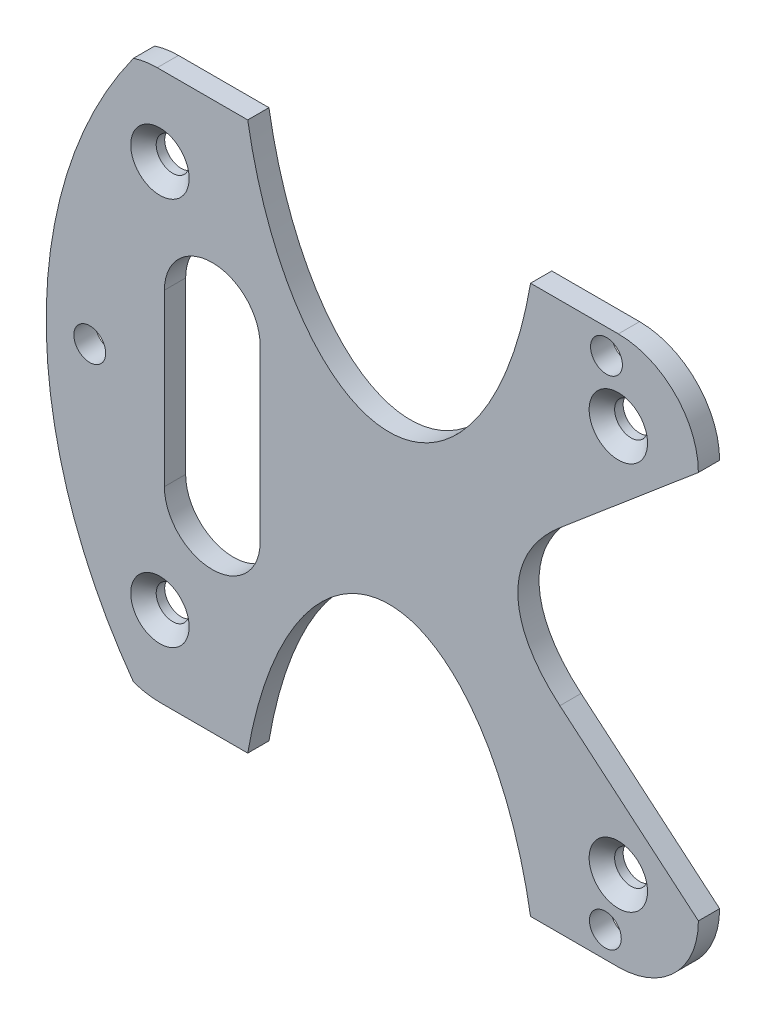
ISO-10303-21;
HEADER;
FILE_DESCRIPTION(('STEP AP214'),'2;1');
FILE_NAME('part.step','',(''),(''),'','','');
FILE_SCHEMA(('AUTOMOTIVE_DESIGN { 1 0 10303 214 1 1 1 1 }'));
ENDSEC;
DATA;
#1=APPLICATION_CONTEXT('core data for automotive mechanical design processes');
#2=APPLICATION_PROTOCOL_DEFINITION('international standard','automotive_design',2000,#1);
#3=PRODUCT_CONTEXT('',#1,'mechanical');
#4=PRODUCT('Part','Part','',(#3));
#5=PRODUCT_RELATED_PRODUCT_CATEGORY('part','',(#4));
#6=PRODUCT_DEFINITION_FORMATION('','',#4);
#7=PRODUCT_DEFINITION_CONTEXT('part definition',#1,'design');
#8=PRODUCT_DEFINITION('design','',#6,#7);
#9=PRODUCT_DEFINITION_SHAPE('','',#8);
#10=(LENGTH_UNIT() NAMED_UNIT(*) SI_UNIT(.MILLI.,.METRE.));
#11=(NAMED_UNIT(*) PLANE_ANGLE_UNIT() SI_UNIT($,.RADIAN.));
#12=(NAMED_UNIT(*) SI_UNIT($,.STERADIAN.) SOLID_ANGLE_UNIT());
#13=UNCERTAINTY_MEASURE_WITH_UNIT(LENGTH_MEASURE(1.E-05),#10,'distance_accuracy_value','');
#14=(GEOMETRIC_REPRESENTATION_CONTEXT(3) GLOBAL_UNCERTAINTY_ASSIGNED_CONTEXT((#13)) GLOBAL_UNIT_ASSIGNED_CONTEXT((#10,
#11,#12)) REPRESENTATION_CONTEXT('',''));
#15=CARTESIAN_POINT('',(0.,0.,0.));
#16=DIRECTION('',(0.,0.,1.));
#17=DIRECTION('',(1.,0.,0.));
#18=AXIS2_PLACEMENT_3D('',#15,#16,#17);
#19=CARTESIAN_POINT('',(0.,-5.,2.));
#20=DIRECTION('',(0.,1.,0.));
#21=DIRECTION('',(-1.,0.,0.));
#22=AXIS2_PLACEMENT_3D('',#19,#20,#21);
#23=PLANE('',#22);
#24=DIRECTION('',(1.,0.,0.));
#25=VECTOR('',#24,1.);
#26=CARTESIAN_POINT('',(0.,-5.,2.));
#27=LINE('',#26,#25);
#28=CARTESIAN_POINT('',(-10.8103320712815,-5.00000000000013,2.));
#29=VERTEX_POINT('',#28);
#30=CARTESIAN_POINT('',(-2.54,-5.,2.));
#31=VERTEX_POINT('',#30);
#32=EDGE_CURVE('E405',#29,#31,#27,.T.);
#33=ORIENTED_EDGE('',*,*,#32,.F.);
#34=DIRECTION('',(0.,0.,-1.));
#35=VECTOR('',#34,1.);
#36=CARTESIAN_POINT('',(-10.8103320712815,-5.00000000000013,2.));
#37=LINE('',#36,#35);
#38=CARTESIAN_POINT('',(-10.8103320712815,-5.00000000000013,0.));
#39=VERTEX_POINT('',#38);
#40=EDGE_CURVE('E284',#29,#39,#37,.T.);
#41=ORIENTED_EDGE('',*,*,#40,.T.);
#42=DIRECTION('',(1.,0.,0.));
#43=VECTOR('',#42,1.);
#44=CARTESIAN_POINT('',(0.,-5.,0.));
#45=LINE('',#44,#43);
#46=CARTESIAN_POINT('',(-2.54,-5.,0.));
#47=VERTEX_POINT('',#46);
#48=EDGE_CURVE('E400',#39,#47,#45,.T.);
#49=ORIENTED_EDGE('',*,*,#48,.T.);
#50=DIRECTION('',(0.,0.,-1.));
#51=VECTOR('',#50,1.);
#52=CARTESIAN_POINT('',(-2.54,-5.,2.));
#53=LINE('',#52,#51);
#54=EDGE_CURVE('E123',#31,#47,#53,.T.);
#55=ORIENTED_EDGE('',*,*,#54,.F.);
#56=EDGE_LOOP('',(#33,#41,#49,#55));
#57=FACE_BOUND('',#56,.T.);
#58=ADVANCED_FACE('F115',(#57),#23,.F.);
#59=CARTESIAN_POINT('',(0.,46.656,2.));
#60=DIRECTION('',(0.,-1.,0.));
#61=DIRECTION('',(0.,0.,-1.));
#62=AXIS2_PLACEMENT_3D('',#59,#60,#61);
#63=PLANE('',#62);
#64=DIRECTION('',(0.,0.,-1.));
#65=VECTOR('',#64,1.);
#66=CARTESIAN_POINT('',(-10.8103320712815,46.656,2.));
#67=LINE('',#66,#65);
#68=CARTESIAN_POINT('',(-10.8103320712815,46.656,2.));
#69=VERTEX_POINT('',#68);
#70=CARTESIAN_POINT('',(-10.8103320712815,46.656,0.));
#71=VERTEX_POINT('',#70);
#72=EDGE_CURVE('E335',#69,#71,#67,.T.);
#73=ORIENTED_EDGE('',*,*,#72,.F.);
#74=DIRECTION('',(-1.,0.,0.));
#75=VECTOR('',#74,1.);
#76=CARTESIAN_POINT('',(0.,46.656,2.));
#77=LINE('',#76,#75);
#78=CARTESIAN_POINT('',(-2.54,46.656,2.));
#79=VERTEX_POINT('',#78);
#80=EDGE_CURVE('E411',#79,#69,#77,.T.);
#81=ORIENTED_EDGE('',*,*,#80,.F.);
#82=DIRECTION('',(0.,0.,-1.));
#83=VECTOR('',#82,1.);
#84=CARTESIAN_POINT('',(-2.54,46.656,2.));
#85=LINE('',#84,#83);
#86=CARTESIAN_POINT('',(-2.54,46.656,0.));
#87=VERTEX_POINT('',#86);
#88=EDGE_CURVE('E442',#79,#87,#85,.T.);
#89=ORIENTED_EDGE('',*,*,#88,.T.);
#90=DIRECTION('',(-1.,0.,0.));
#91=VECTOR('',#90,1.);
#92=CARTESIAN_POINT('',(0.,46.656,0.));
#93=LINE('',#92,#91);
#94=EDGE_CURVE('E429',#87,#71,#93,.T.);
#95=ORIENTED_EDGE('',*,*,#94,.T.);
#96=EDGE_LOOP('',(#73,#81,#89,#95));
#97=FACE_BOUND('',#96,.T.);
#98=ADVANCED_FACE('F499',(#97),#63,.F.);
#99=DIRECTION('',(0.,0.,-1.));
#100=VECTOR('',#99,1.);
#101=CARTESIAN_POINT('',(-37.44966792872,46.656,2.));
#102=LINE('',#101,#100);
#103=CARTESIAN_POINT('',(-37.44966792872,46.656,2.));
#104=VERTEX_POINT('',#103);
#105=CARTESIAN_POINT('',(-37.44966792872,46.656,0.));
#106=VERTEX_POINT('',#105);
#107=EDGE_CURVE('E339',#104,#106,#102,.T.);
#108=ORIENTED_EDGE('',*,*,#107,.T.);
#109=CARTESIAN_POINT('',(-45.974,46.656,0.));
#110=VERTEX_POINT('',#109);
#111=EDGE_CURVE('E428',#106,#110,#93,.T.);
#112=ORIENTED_EDGE('',*,*,#111,.T.);
#113=DIRECTION('',(0.,0.,-1.));
#114=VECTOR('',#113,1.);
#115=CARTESIAN_POINT('',(-45.974,46.656,2.));
#116=LINE('',#115,#114);
#117=CARTESIAN_POINT('',(-45.974,46.656,2.));
#118=VERTEX_POINT('',#117);
#119=EDGE_CURVE('E439',#118,#110,#116,.T.);
#120=ORIENTED_EDGE('',*,*,#119,.F.);
#121=EDGE_CURVE('E410',#104,#118,#77,.T.);
#122=ORIENTED_EDGE('',*,*,#121,.F.);
#123=EDGE_LOOP('',(#108,#112,#120,#122));
#124=FACE_BOUND('',#123,.T.);
#125=ADVANCED_FACE('F491',(#124),#63,.F.);
#126=CARTESIAN_POINT('',(-45.974,39.37,2.));
#127=DIRECTION('',(0.,0.,-1.));
#128=DIRECTION('',(-1.,0.,0.));
#129=AXIS2_PLACEMENT_3D('',#126,#127,#128);
#130=CYLINDRICAL_SURFACE('',#129,7.28599999999999);
#131=CARTESIAN_POINT('',(-45.974,39.37,0.));
#132=DIRECTION('',(0.,0.,1.));
#133=DIRECTION('',(1.,0.,0.));
#134=AXIS2_PLACEMENT_3D('',#131,#132,#133);
#135=CIRCLE('',#134,7.28599999999999);
#136=CARTESIAN_POINT('',(-48.2121691469728,46.3037143631346,0.));
#137=VERTEX_POINT('',#136);
#138=EDGE_CURVE('E432',#110,#137,#135,.T.);
#139=ORIENTED_EDGE('',*,*,#138,.T.);
#140=DIRECTION('',(0.,0.,-1.));
#141=VECTOR('',#140,1.);
#142=CARTESIAN_POINT('',(-48.2121691469728,46.3037143631348,2.));
#143=LINE('',#142,#141);
#144=CARTESIAN_POINT('',(-48.2121691469728,46.3037143631348,2.));
#145=VERTEX_POINT('',#144);
#146=EDGE_CURVE('E342',#145,#137,#143,.T.);
#147=ORIENTED_EDGE('',*,*,#146,.F.);
#148=CARTESIAN_POINT('',(-45.974,39.37,2.));
#149=DIRECTION('',(0.,0.,1.));
#150=DIRECTION('',(1.,0.,0.));
#151=AXIS2_PLACEMENT_3D('',#148,#149,#150);
#152=CIRCLE('',#151,7.28599999999999);
#153=EDGE_CURVE('E414',#118,#145,#152,.T.);
#154=ORIENTED_EDGE('',*,*,#153,.F.);
#155=ORIENTED_EDGE('',*,*,#119,.T.);
#156=EDGE_LOOP('',(#139,#147,#154,#155));
#157=FACE_BOUND('',#156,.T.);
#158=ADVANCED_FACE('F486',(#157),#130,.T.);
#159=CARTESIAN_POINT('',(0.,0.,2.));
#160=DIRECTION('',(0.,0.,1.));
#161=DIRECTION('',(1.,0.,0.));
#162=AXIS2_PLACEMENT_3D('',#159,#160,#161);
#163=PLANE('',#162);
#164=CARTESIAN_POINT('',(-12.9481368309943,20.8616248525129,2.));
#165=DIRECTION('',(0.,0.,1.));
#166=DIRECTION('',(1.,0.,0.));
#167=AXIS2_PLACEMENT_3D('',#164,#165,#166);
#168=CIRCLE('',#167,43.483926844857);
#169=CARTESIAN_POINT('',(-48.2162601004841,-4.57479342713004,2.));
#170=VERTEX_POINT('',#169);
#171=EDGE_CURVE('E346',#145,#170,#168,.T.);
#172=ORIENTED_EDGE('',*,*,#171,.T.);
#173=CARTESIAN_POINT('',(-45.72,2.54,2.));
#174=DIRECTION('',(0.,0.,1.));
#175=DIRECTION('',(1.,0.,0.));
#176=AXIS2_PLACEMENT_3D('',#173,#174,#175);
#177=CIRCLE('',#176,7.54);
#178=CARTESIAN_POINT('',(-45.72,-5.,2.));
#179=VERTEX_POINT('',#178);
#180=EDGE_CURVE('E417',#170,#179,#177,.T.);
#181=ORIENTED_EDGE('',*,*,#180,.T.);
#182=CARTESIAN_POINT('',(-37.44966792872,-5.00000000000003,2.));
#183=VERTEX_POINT('',#182);
#184=EDGE_CURVE('E401',#179,#183,#27,.T.);
#185=ORIENTED_EDGE('',*,*,#184,.T.);
#186=CARTESIAN_POINT('',(-24.1300000000008,-13.6699373174905,2.));
#187=DIRECTION('',(0.,0.,-1.));
#188=DIRECTION('',(0.,1.,0.));
#189=AXIS2_PLACEMENT_3D('',#186,#187,#188);
#190=ELLIPSE('',#189,27.4772201277716,14.0367345706409);
#191=EDGE_CURVE('E280',#183,#29,#190,.T.);
#192=ORIENTED_EDGE('',*,*,#191,.T.);
#193=ORIENTED_EDGE('',*,*,#32,.T.);
#194=CARTESIAN_POINT('',(-2.54,2.54,2.));
#195=DIRECTION('',(0.,0.,1.));
#196=DIRECTION('',(1.,0.,0.));
#197=AXIS2_PLACEMENT_3D('',#194,#195,#196);
#198=CIRCLE('',#197,7.54);
#199=CARTESIAN_POINT('',(4.99999999999989,2.54,2.));
#200=VERTEX_POINT('',#199);
#201=EDGE_CURVE('E404',#31,#200,#198,.T.);
#202=ORIENTED_EDGE('',*,*,#201,.T.);
#203=DIRECTION('',(0.763672536587302,-0.645603792478263,0.));
#204=VECTOR('',#203,1.);
#205=CARTESIAN_POINT('',(3.33631719432547,3.94646661673095,2.));
#206=LINE('',#205,#204);
#207=CARTESIAN_POINT('',(-8.04769263145483,13.5704344367304,2.));
#208=VERTEX_POINT('',#207);
#209=EDGE_CURVE('E315',#208,#200,#206,.T.);
#210=ORIENTED_EDGE('',*,*,#209,.F.);
#211=CARTESIAN_POINT('',(15.4693627988122,20.8300000000053,2.));
#212=DIRECTION('',(0.,0.,-1.));
#213=DIRECTION('',(-1.,0.,0.));
#214=AXIS2_PLACEMENT_3D('',#211,#212,#213);
#215=ELLIPSE('',#214,27.4772201277716,14.036734570641);
#216=CARTESIAN_POINT('',(-8.04541044844901,28.091494556042,2.));
#217=VERTEX_POINT('',#216);
#218=EDGE_CURVE('E310',#208,#217,#215,.T.);
#219=ORIENTED_EDGE('',*,*,#218,.T.);
#220=DIRECTION('',(0.763787978730366,0.645467213378791,0.));
#221=VECTOR('',#220,1.);
#222=CARTESIAN_POINT('',(-17.2010522251506,20.35418165132,2.));
#223=LINE('',#222,#221);
#224=CARTESIAN_POINT('',(4.9999999999994,39.116,2.));
#225=VERTEX_POINT('',#224);
#226=EDGE_CURVE('E319',#217,#225,#223,.T.);
#227=ORIENTED_EDGE('',*,*,#226,.T.);
#228=CARTESIAN_POINT('',(-2.54,39.116,2.));
#229=DIRECTION('',(0.,0.,1.));
#230=DIRECTION('',(1.,0.,0.));
#231=AXIS2_PLACEMENT_3D('',#228,#229,#230);
#232=CIRCLE('',#231,7.54);
#233=EDGE_CURVE('E408',#225,#79,#232,.T.);
#234=ORIENTED_EDGE('',*,*,#233,.T.);
#235=ORIENTED_EDGE('',*,*,#80,.T.);
#236=CARTESIAN_POINT('',(-24.1300000000008,55.3259373174905,2.));
#237=DIRECTION('',(0.,0.,1.));
#238=DIRECTION('',(0.,-1.,0.));
#239=AXIS2_PLACEMENT_3D('',#236,#237,#238);
#240=ELLIPSE('',#239,27.4772201277716,14.0367345706409);
#241=EDGE_CURVE('E332',#104,#69,#240,.T.);
#242=ORIENTED_EDGE('',*,*,#241,.F.);
#243=ORIENTED_EDGE('',*,*,#121,.T.);
#244=ORIENTED_EDGE('',*,*,#153,.T.);
#245=EDGE_LOOP('',(#172,#181,#185,#192,#193,#202,#210,#219,#227,#234,#235,#242,#243,#244));
#246=FACE_BOUND('',#245,.T.);
#247=CARTESIAN_POINT('',(-52.3305474622759,20.9250470518633,2.));
#248=DIRECTION('',(0.,0.,1.));
#249=DIRECTION('',(1.,0.,0.));
#250=AXIS2_PLACEMENT_3D('',#247,#248,#249);
#251=CIRCLE('',#250,1.5);
#252=CARTESIAN_POINT('',(-50.8305474622759,20.9250470518633,2.));
#253=VERTEX_POINT('',#252);
#254=EDGE_CURVE('E357',#253,#253,#251,.T.);
#255=ORIENTED_EDGE('',*,*,#254,.F.);
#256=EDGE_LOOP('',(#255));
#257=FACE_BOUND('',#256,.T.);
#258=CARTESIAN_POINT('',(-3.65838616904421,44.3104460061036,2.));
#259=DIRECTION('',(0.,0.,1.));
#260=DIRECTION('',(1.,0.,0.));
#261=AXIS2_PLACEMENT_3D('',#258,#259,#260);
#262=CIRCLE('',#261,1.5);
#263=CARTESIAN_POINT('',(-2.15838616904421,44.3104460061036,2.));
#264=VERTEX_POINT('',#263);
#265=EDGE_CURVE('E350',#264,#264,#262,.T.);
#266=ORIENTED_EDGE('',*,*,#265,.F.);
#267=EDGE_LOOP('',(#266));
#268=FACE_BOUND('',#267,.T.);
#269=CARTESIAN_POINT('',(-3.76348656069617,-2.55166374158347,2.));
#270=DIRECTION('',(0.,0.,1.));
#271=DIRECTION('',(1.,0.,0.));
#272=AXIS2_PLACEMENT_3D('',#269,#270,#271);
#273=CIRCLE('',#272,1.5);
#274=CARTESIAN_POINT('',(-2.26348656069617,-2.55166374158347,2.));
#275=VERTEX_POINT('',#274);
#276=EDGE_CURVE('E348',#275,#275,#273,.T.);
#277=ORIENTED_EDGE('',*,*,#276,.F.);
#278=EDGE_LOOP('',(#277));
#279=FACE_BOUND('',#278,.T.);
#280=CARTESIAN_POINT('',(-2.54,2.54,2.));
#281=DIRECTION('',(0.,0.,1.));
#282=DIRECTION('',(1.,0.,0.));
#283=AXIS2_PLACEMENT_3D('',#280,#281,#282);
#284=CIRCLE('',#283,2.75);
#285=CARTESIAN_POINT('',(0.209999999999999,2.54,2.));
#286=VERTEX_POINT('',#285);
#287=EDGE_CURVE('E353',#286,#286,#284,.T.);
#288=ORIENTED_EDGE('',*,*,#287,.F.);
#289=EDGE_LOOP('',(#288));
#290=FACE_BOUND('',#289,.T.);
#291=CARTESIAN_POINT('',(-2.54,39.116,2.));
#292=DIRECTION('',(0.,0.,1.));
#293=DIRECTION('',(1.,0.,0.));
#294=AXIS2_PLACEMENT_3D('',#291,#292,#293);
#295=CIRCLE('',#294,2.75);
#296=CARTESIAN_POINT('',(0.209999999999999,39.116,2.));
#297=VERTEX_POINT('',#296);
#298=EDGE_CURVE('E373',#297,#297,#295,.T.);
#299=ORIENTED_EDGE('',*,*,#298,.F.);
#300=EDGE_LOOP('',(#299));
#301=FACE_BOUND('',#300,.T.);
#302=CARTESIAN_POINT('',(-45.72,39.116,2.));
#303=DIRECTION('',(0.,0.,1.));
#304=DIRECTION('',(1.,0.,0.));
#305=AXIS2_PLACEMENT_3D('',#302,#303,#304);
#306=CIRCLE('',#305,2.75);
#307=CARTESIAN_POINT('',(-42.97,39.116,2.));
#308=VERTEX_POINT('',#307);
#309=EDGE_CURVE('E382',#308,#308,#306,.T.);
#310=ORIENTED_EDGE('',*,*,#309,.F.);
#311=EDGE_LOOP('',(#310));
#312=FACE_BOUND('',#311,.T.);
#313=CARTESIAN_POINT('',(-45.72,2.54,2.));
#314=DIRECTION('',(0.,0.,1.));
#315=DIRECTION('',(1.,0.,0.));
#316=AXIS2_PLACEMENT_3D('',#313,#314,#315);
#317=CIRCLE('',#316,2.75);
#318=CARTESIAN_POINT('',(-42.97,2.54,2.));
#319=VERTEX_POINT('',#318);
#320=EDGE_CURVE('E391',#319,#319,#317,.T.);
#321=ORIENTED_EDGE('',*,*,#320,.F.);
#322=EDGE_LOOP('',(#321));
#323=FACE_BOUND('',#322,.T.);
#324=CARTESIAN_POINT('',(-40.7895700493337,28.8408832705907,2.));
#325=DIRECTION('',(0.,0.,1.));
#326=DIRECTION('',(1.,0.,0.));
#327=AXIS2_PLACEMENT_3D('',#324,#325,#326);
#328=CIRCLE('',#327,4.50921395721782);
#329=CARTESIAN_POINT('',(-36.2803560921159,28.8408832705907,2.));
#330=VERTEX_POINT('',#329);
#331=CARTESIAN_POINT('',(-45.2987840065515,28.8408832705907,2.));
#332=VERTEX_POINT('',#331);
#333=EDGE_CURVE('E252',#330,#332,#328,.T.);
#334=ORIENTED_EDGE('',*,*,#333,.F.);
#335=DIRECTION('',(0.,1.,0.));
#336=VECTOR('',#335,1.);
#337=CARTESIAN_POINT('',(-36.2803560921159,0.,2.));
#338=LINE('',#337,#336);
#339=CARTESIAN_POINT('',(-36.2803560921159,12.8151167294093,2.));
#340=VERTEX_POINT('',#339);
#341=EDGE_CURVE('E242',#340,#330,#338,.T.);
#342=ORIENTED_EDGE('',*,*,#341,.F.);
#343=CARTESIAN_POINT('',(-40.7895700493337,12.8151167294093,2.));
#344=DIRECTION('',(0.,0.,1.));
#345=DIRECTION('',(1.,0.,0.));
#346=AXIS2_PLACEMENT_3D('',#343,#344,#345);
#347=CIRCLE('',#346,4.50921395721782);
#348=CARTESIAN_POINT('',(-45.2987840065515,12.8151167294093,2.));
#349=VERTEX_POINT('',#348);
#350=EDGE_CURVE('E264',#349,#340,#347,.T.);
#351=ORIENTED_EDGE('',*,*,#350,.F.);
#352=DIRECTION('',(0.,1.,0.));
#353=VECTOR('',#352,1.);
#354=CARTESIAN_POINT('',(-45.2987840065515,0.,2.));
#355=LINE('',#354,#353);
#356=EDGE_CURVE('E130',#349,#332,#355,.T.);
#357=ORIENTED_EDGE('',*,*,#356,.T.);
#358=EDGE_LOOP('',(#334,#342,#351,#357));
#359=FACE_BOUND('',#358,.T.);
#360=ADVANCED_FACE('F262',(#246,#257,#268,#279,#290,#301,#312,#323,#359),#163,.T.);
#361=CARTESIAN_POINT('',(0.,0.,0.));
#362=DIRECTION('',(0.,0.,1.));
#363=DIRECTION('',(1.,0.,0.));
#364=AXIS2_PLACEMENT_3D('',#361,#362,#363);
#365=PLANE('',#364);
#366=CARTESIAN_POINT('',(-45.72,2.54,0.));
#367=DIRECTION('',(0.,0.,1.));
#368=DIRECTION('',(1.,0.,0.));
#369=AXIS2_PLACEMENT_3D('',#366,#367,#368);
#370=CIRCLE('',#369,1.55);
#371=CARTESIAN_POINT('',(-44.17,2.54,0.));
#372=VERTEX_POINT('',#371);
#373=EDGE_CURVE('E397',#372,#372,#370,.T.);
#374=ORIENTED_EDGE('',*,*,#373,.T.);
#375=EDGE_LOOP('',(#374));
#376=FACE_BOUND('',#375,.T.);
#377=CARTESIAN_POINT('',(-45.72,39.116,0.));
#378=DIRECTION('',(0.,0.,1.));
#379=DIRECTION('',(1.,0.,0.));
#380=AXIS2_PLACEMENT_3D('',#377,#378,#379);
#381=CIRCLE('',#380,1.55);
#382=CARTESIAN_POINT('',(-44.17,39.116,0.));
#383=VERTEX_POINT('',#382);
#384=EDGE_CURVE('E388',#383,#383,#381,.T.);
#385=ORIENTED_EDGE('',*,*,#384,.T.);
#386=EDGE_LOOP('',(#385));
#387=FACE_BOUND('',#386,.T.);
#388=CARTESIAN_POINT('',(-2.54,39.116,0.));
#389=DIRECTION('',(0.,0.,1.));
#390=DIRECTION('',(1.,0.,0.));
#391=AXIS2_PLACEMENT_3D('',#388,#389,#390);
#392=CIRCLE('',#391,1.55);
#393=CARTESIAN_POINT('',(-0.99,39.116,0.));
#394=VERTEX_POINT('',#393);
#395=EDGE_CURVE('E379',#394,#394,#392,.T.);
#396=ORIENTED_EDGE('',*,*,#395,.T.);
#397=EDGE_LOOP('',(#396));
#398=FACE_BOUND('',#397,.T.);
#399=CARTESIAN_POINT('',(-2.54,2.54,0.));
#400=DIRECTION('',(0.,0.,1.));
#401=DIRECTION('',(1.,0.,0.));
#402=AXIS2_PLACEMENT_3D('',#399,#400,#401);
#403=CIRCLE('',#402,1.55);
#404=CARTESIAN_POINT('',(-0.99,2.54,0.));
#405=VERTEX_POINT('',#404);
#406=EDGE_CURVE('E370',#405,#405,#403,.T.);
#407=ORIENTED_EDGE('',*,*,#406,.T.);
#408=EDGE_LOOP('',(#407));
#409=FACE_BOUND('',#408,.T.);
#410=CARTESIAN_POINT('',(-3.76348656069617,-2.55166374158347,0.));
#411=DIRECTION('',(0.,0.,1.));
#412=DIRECTION('',(1.,0.,0.));
#413=AXIS2_PLACEMENT_3D('',#410,#411,#412);
#414=CIRCLE('',#413,1.5);
#415=CARTESIAN_POINT('',(-2.26348656069617,-2.55166374158347,0.));
#416=VERTEX_POINT('',#415);
#417=EDGE_CURVE('E360',#416,#416,#414,.T.);
#418=ORIENTED_EDGE('',*,*,#417,.T.);
#419=EDGE_LOOP('',(#418));
#420=FACE_BOUND('',#419,.T.);
#421=CARTESIAN_POINT('',(-3.65838616904421,44.3104460061036,0.));
#422=DIRECTION('',(0.,0.,1.));
#423=DIRECTION('',(1.,0.,0.));
#424=AXIS2_PLACEMENT_3D('',#421,#422,#423);
#425=CIRCLE('',#424,1.5);
#426=CARTESIAN_POINT('',(-2.15838616904421,44.3104460061036,0.));
#427=VERTEX_POINT('',#426);
#428=EDGE_CURVE('E354',#427,#427,#425,.T.);
#429=ORIENTED_EDGE('',*,*,#428,.T.);
#430=EDGE_LOOP('',(#429));
#431=FACE_BOUND('',#430,.T.);
#432=CARTESIAN_POINT('',(-52.3305474622759,20.9250470518633,0.));
#433=DIRECTION('',(0.,0.,1.));
#434=DIRECTION('',(1.,0.,0.));
#435=AXIS2_PLACEMENT_3D('',#432,#433,#434);
#436=CIRCLE('',#435,1.5);
#437=CARTESIAN_POINT('',(-50.8305474622759,20.9250470518633,0.));
#438=VERTEX_POINT('',#437);
#439=EDGE_CURVE('E12',#438,#438,#436,.F.);
#440=ORIENTED_EDGE('',*,*,#439,.F.);
#441=EDGE_LOOP('',(#440));
#442=FACE_BOUND('',#441,.T.);
#443=DIRECTION('',(0.,1.,0.));
#444=VECTOR('',#443,1.);
#445=CARTESIAN_POINT('',(-36.2803560921159,0.,0.));
#446=LINE('',#445,#444);
#447=CARTESIAN_POINT('',(-36.2803560921159,12.8151167294093,0.));
#448=VERTEX_POINT('',#447);
#449=CARTESIAN_POINT('',(-36.2803560921159,28.8408832705907,0.));
#450=VERTEX_POINT('',#449);
#451=EDGE_CURVE('E268',#448,#450,#446,.T.);
#452=ORIENTED_EDGE('',*,*,#451,.T.);
#453=CARTESIAN_POINT('',(-40.7895700493337,28.8408832705907,0.));
#454=DIRECTION('',(0.,0.,1.));
#455=DIRECTION('',(1.,0.,0.));
#456=AXIS2_PLACEMENT_3D('',#453,#454,#455);
#457=CIRCLE('',#456,4.50921395721782);
#458=CARTESIAN_POINT('',(-45.2987840065515,28.8408832705907,0.));
#459=VERTEX_POINT('',#458);
#460=EDGE_CURVE('E258',#450,#459,#457,.T.);
#461=ORIENTED_EDGE('',*,*,#460,.T.);
#462=DIRECTION('',(0.,1.,0.));
#463=VECTOR('',#462,1.);
#464=CARTESIAN_POINT('',(-45.2987840065515,0.,0.));
#465=LINE('',#464,#463);
#466=CARTESIAN_POINT('',(-45.2987840065515,12.8151167294093,0.));
#467=VERTEX_POINT('',#466);
#468=EDGE_CURVE('E271',#467,#459,#465,.T.);
#469=ORIENTED_EDGE('',*,*,#468,.F.);
#470=CARTESIAN_POINT('',(-40.7895700493337,12.8151167294093,0.));
#471=DIRECTION('',(0.,0.,1.));
#472=DIRECTION('',(1.,0.,0.));
#473=AXIS2_PLACEMENT_3D('',#470,#471,#472);
#474=CIRCLE('',#473,4.50921395721782);
#475=EDGE_CURVE('E253',#467,#448,#474,.T.);
#476=ORIENTED_EDGE('',*,*,#475,.T.);
#477=EDGE_LOOP('',(#452,#461,#469,#476));
#478=FACE_BOUND('',#477,.T.);
#479=CARTESIAN_POINT('',(-45.72,2.54,0.));
#480=DIRECTION('',(0.,0.,1.));
#481=DIRECTION('',(1.,0.,0.));
#482=AXIS2_PLACEMENT_3D('',#479,#480,#481);
#483=CIRCLE('',#482,7.54);
#484=CARTESIAN_POINT('',(-48.2162601004841,-4.57479342713004,0.));
#485=VERTEX_POINT('',#484);
#486=CARTESIAN_POINT('',(-45.72,-5.,0.));
#487=VERTEX_POINT('',#486);
#488=EDGE_CURVE('E435',#485,#487,#483,.T.);
#489=ORIENTED_EDGE('',*,*,#488,.F.);
#490=CARTESIAN_POINT('',(-12.9481368309943,20.8616248525129,0.));
#491=DIRECTION('',(0.,0.,1.));
#492=DIRECTION('',(1.,0.,0.));
#493=AXIS2_PLACEMENT_3D('',#490,#491,#492);
#494=CIRCLE('',#493,43.483926844857);
#495=EDGE_CURVE('E345',#137,#485,#494,.T.);
#496=ORIENTED_EDGE('',*,*,#495,.F.);
#497=ORIENTED_EDGE('',*,*,#138,.F.);
#498=ORIENTED_EDGE('',*,*,#111,.F.);
#499=CARTESIAN_POINT('',(-24.1300000000008,55.3259373174905,0.));
#500=DIRECTION('',(0.,0.,1.));
#501=DIRECTION('',(0.,-1.,0.));
#502=AXIS2_PLACEMENT_3D('',#499,#500,#501);
#503=ELLIPSE('',#502,27.4772201277716,14.0367345706409);
#504=EDGE_CURVE('E331',#106,#71,#503,.T.);
#505=ORIENTED_EDGE('',*,*,#504,.T.);
#506=ORIENTED_EDGE('',*,*,#94,.F.);
#507=CARTESIAN_POINT('',(-2.54,39.116,0.));
#508=DIRECTION('',(0.,0.,1.));
#509=DIRECTION('',(1.,0.,0.));
#510=AXIS2_PLACEMENT_3D('',#507,#508,#509);
#511=CIRCLE('',#510,7.54);
#512=CARTESIAN_POINT('',(4.9999999999994,39.116,0.));
#513=VERTEX_POINT('',#512);
#514=EDGE_CURVE('E426',#513,#87,#511,.T.);
#515=ORIENTED_EDGE('',*,*,#514,.F.);
#516=DIRECTION('',(0.763787978730366,0.645467213378791,0.));
#517=VECTOR('',#516,1.);
#518=CARTESIAN_POINT('',(-17.2010522251506,20.35418165132,0.));
#519=LINE('',#518,#517);
#520=CARTESIAN_POINT('',(-8.04541044844901,28.091494556042,0.));
#521=VERTEX_POINT('',#520);
#522=EDGE_CURVE('E316',#521,#513,#519,.T.);
#523=ORIENTED_EDGE('',*,*,#522,.F.);
#524=CARTESIAN_POINT('',(15.4693627988122,20.8300000000053,0.));
#525=DIRECTION('',(0.,0.,-1.));
#526=DIRECTION('',(-1.,0.,0.));
#527=AXIS2_PLACEMENT_3D('',#524,#525,#526);
#528=ELLIPSE('',#527,27.4772201277716,14.036734570641);
#529=CARTESIAN_POINT('',(-8.04769263145483,13.5704344367304,0.));
#530=VERTEX_POINT('',#529);
#531=EDGE_CURVE('E138',#530,#521,#528,.T.);
#532=ORIENTED_EDGE('',*,*,#531,.F.);
#533=DIRECTION('',(0.763672536587302,-0.645603792478263,0.));
#534=VECTOR('',#533,1.);
#535=CARTESIAN_POINT('',(3.33631719432547,3.94646661673095,0.));
#536=LINE('',#535,#534);
#537=CARTESIAN_POINT('',(4.99999999999989,2.54,0.));
#538=VERTEX_POINT('',#537);
#539=EDGE_CURVE('E324',#530,#538,#536,.T.);
#540=ORIENTED_EDGE('',*,*,#539,.T.);
#541=CARTESIAN_POINT('',(-2.54,2.54,0.));
#542=DIRECTION('',(0.,0.,1.));
#543=DIRECTION('',(1.,0.,0.));
#544=AXIS2_PLACEMENT_3D('',#541,#542,#543);
#545=CIRCLE('',#544,7.54);
#546=EDGE_CURVE('E423',#47,#538,#545,.T.);
#547=ORIENTED_EDGE('',*,*,#546,.F.);
#548=ORIENTED_EDGE('',*,*,#48,.F.);
#549=CARTESIAN_POINT('',(-24.1300000000008,-13.6699373174905,0.));
#550=DIRECTION('',(0.,0.,-1.));
#551=DIRECTION('',(0.,1.,0.));
#552=AXIS2_PLACEMENT_3D('',#549,#550,#551);
#553=ELLIPSE('',#552,27.4772201277716,14.0367345706409);
#554=CARTESIAN_POINT('',(-37.44966792872,-5.,0.));
#555=VERTEX_POINT('',#554);
#556=EDGE_CURVE('E285',#555,#39,#553,.T.);
#557=ORIENTED_EDGE('',*,*,#556,.F.);
#558=EDGE_CURVE('E420',#487,#555,#45,.T.);
#559=ORIENTED_EDGE('',*,*,#558,.F.);
#560=EDGE_LOOP('',(#489,#496,#497,#498,#505,#506,#515,#523,#532,#540,#547,#548,#557,#559));
#561=FACE_BOUND('',#560,.T.);
#562=ADVANCED_FACE('F463',(#376,#387,#398,#409,#420,#431,#442,#478,#561),#365,.F.);
#563=ORIENTED_EDGE('',*,*,#558,.T.);
#564=DIRECTION('',(0.,0.,-1.));
#565=VECTOR('',#564,1.);
#566=CARTESIAN_POINT('',(-37.44966792872,-5.00000000000003,2.));
#567=LINE('',#566,#565);
#568=EDGE_CURVE('E325',#183,#555,#567,.T.);
#569=ORIENTED_EDGE('',*,*,#568,.F.);
#570=ORIENTED_EDGE('',*,*,#184,.F.);
#571=DIRECTION('',(0.,0.,-1.));
#572=VECTOR('',#571,1.);
#573=CARTESIAN_POINT('',(-45.72,-5.,2.));
#574=LINE('',#573,#572);
#575=EDGE_CURVE('E419',#179,#487,#574,.T.);
#576=ORIENTED_EDGE('',*,*,#575,.T.);
#577=EDGE_LOOP('',(#563,#569,#570,#576));
#578=FACE_BOUND('',#577,.T.);
#579=ADVANCED_FACE('F117',(#578),#23,.F.);
#580=CARTESIAN_POINT('',(-2.54,2.54,2.));
#581=DIRECTION('',(0.,0.,-1.));
#582=DIRECTION('',(-1.,0.,0.));
#583=AXIS2_PLACEMENT_3D('',#580,#581,#582);
#584=CYLINDRICAL_SURFACE('',#583,7.54);
#585=ORIENTED_EDGE('',*,*,#546,.T.);
#586=DIRECTION('',(0.,0.,-1.));
#587=VECTOR('',#586,1.);
#588=CARTESIAN_POINT('',(5.,2.54,2.));
#589=LINE('',#588,#587);
#590=EDGE_CURVE('E448',#200,#538,#589,.T.);
#591=ORIENTED_EDGE('',*,*,#590,.F.);
#592=ORIENTED_EDGE('',*,*,#201,.F.);
#593=ORIENTED_EDGE('',*,*,#54,.T.);
#594=EDGE_LOOP('',(#585,#591,#592,#593));
#595=FACE_BOUND('',#594,.T.);
#596=ADVANCED_FACE('F453',(#595),#584,.T.);
#597=CARTESIAN_POINT('',(-2.54,39.116,2.));
#598=DIRECTION('',(0.,0.,-1.));
#599=DIRECTION('',(-1.,0.,0.));
#600=AXIS2_PLACEMENT_3D('',#597,#598,#599);
#601=CYLINDRICAL_SURFACE('',#600,7.54);
#602=ORIENTED_EDGE('',*,*,#514,.T.);
#603=ORIENTED_EDGE('',*,*,#88,.F.);
#604=ORIENTED_EDGE('',*,*,#233,.F.);
#605=DIRECTION('',(0.,0.,-1.));
#606=VECTOR('',#605,1.);
#607=CARTESIAN_POINT('',(5.,39.116,2.));
#608=LINE('',#607,#606);
#609=EDGE_CURVE('E445',#225,#513,#608,.T.);
#610=ORIENTED_EDGE('',*,*,#609,.T.);
#611=EDGE_LOOP('',(#602,#603,#604,#610));
#612=FACE_BOUND('',#611,.T.);
#613=ADVANCED_FACE('F503',(#612),#601,.T.);
#614=CARTESIAN_POINT('',(-45.72,2.54,2.));
#615=DIRECTION('',(0.,0.,-1.));
#616=DIRECTION('',(-1.,0.,0.));
#617=AXIS2_PLACEMENT_3D('',#614,#615,#616);
#618=CYLINDRICAL_SURFACE('',#617,7.54);
#619=ORIENTED_EDGE('',*,*,#180,.F.);
#620=DIRECTION('',(0.,0.,-1.));
#621=VECTOR('',#620,1.);
#622=CARTESIAN_POINT('',(-48.2162601004841,-4.57479342713004,2.));
#623=LINE('',#622,#621);
#624=EDGE_CURVE('E259',#170,#485,#623,.T.);
#625=ORIENTED_EDGE('',*,*,#624,.T.);
#626=ORIENTED_EDGE('',*,*,#488,.T.);
#627=ORIENTED_EDGE('',*,*,#575,.F.);
#628=EDGE_LOOP('',(#619,#625,#626,#627));
#629=FACE_BOUND('',#628,.T.);
#630=ADVANCED_FACE('F479',(#629),#618,.T.);
#631=CARTESIAN_POINT('',(-45.72,2.54,2.));
#632=DIRECTION('',(0.,0.,1.));
#633=DIRECTION('',(1.,0.,0.));
#634=AXIS2_PLACEMENT_3D('',#631,#632,#633);
#635=CYLINDRICAL_SURFACE('',#634,1.55);
#636=ORIENTED_EDGE('',*,*,#373,.F.);
#637=EDGE_LOOP('',(#636));
#638=FACE_BOUND('',#637,.T.);
#639=CARTESIAN_POINT('',(-45.72,2.54,0.8));
#640=DIRECTION('',(0.,0.,1.));
#641=DIRECTION('',(1.,0.,0.));
#642=AXIS2_PLACEMENT_3D('',#639,#640,#641);
#643=CIRCLE('',#642,1.55);
#644=CARTESIAN_POINT('',(-44.17,2.54,0.8));
#645=VERTEX_POINT('',#644);
#646=EDGE_CURVE('E394',#645,#645,#643,.T.);
#647=ORIENTED_EDGE('',*,*,#646,.T.);
#648=EDGE_LOOP('',(#647));
#649=FACE_BOUND('',#648,.T.);
#650=ADVANCED_FACE('F511',(#638,#649),#635,.F.);
#651=CARTESIAN_POINT('',(-45.72,2.54,2.));
#652=DIRECTION('',(0.,0.,1.));
#653=DIRECTION('',(1.,0.,0.));
#654=AXIS2_PLACEMENT_3D('',#651,#652,#653);
#655=CONICAL_SURFACE('',#654,2.75,0.785398163397447);
#656=ORIENTED_EDGE('',*,*,#646,.F.);
#657=EDGE_LOOP('',(#656));
#658=FACE_BOUND('',#657,.T.);
#659=ORIENTED_EDGE('',*,*,#320,.T.);
#660=EDGE_LOOP('',(#659));
#661=FACE_BOUND('',#660,.T.);
#662=ADVANCED_FACE('F636',(#658,#661),#655,.F.);
#663=CARTESIAN_POINT('',(-45.72,39.116,2.));
#664=DIRECTION('',(0.,0.,1.));
#665=DIRECTION('',(1.,0.,0.));
#666=AXIS2_PLACEMENT_3D('',#663,#664,#665);
#667=CYLINDRICAL_SURFACE('',#666,1.55);
#668=ORIENTED_EDGE('',*,*,#384,.F.);
#669=EDGE_LOOP('',(#668));
#670=FACE_BOUND('',#669,.T.);
#671=CARTESIAN_POINT('',(-45.72,39.116,0.8));
#672=DIRECTION('',(0.,0.,1.));
#673=DIRECTION('',(1.,0.,0.));
#674=AXIS2_PLACEMENT_3D('',#671,#672,#673);
#675=CIRCLE('',#674,1.55);
#676=CARTESIAN_POINT('',(-44.17,39.116,0.8));
#677=VERTEX_POINT('',#676);
#678=EDGE_CURVE('E385',#677,#677,#675,.T.);
#679=ORIENTED_EDGE('',*,*,#678,.T.);
#680=EDGE_LOOP('',(#679));
#681=FACE_BOUND('',#680,.T.);
#682=ADVANCED_FACE('F645',(#670,#681),#667,.F.);
#683=CARTESIAN_POINT('',(-45.72,39.116,2.));
#684=DIRECTION('',(0.,0.,1.));
#685=DIRECTION('',(1.,0.,0.));
#686=AXIS2_PLACEMENT_3D('',#683,#684,#685);
#687=CONICAL_SURFACE('',#686,2.75,0.785398163397447);
#688=ORIENTED_EDGE('',*,*,#678,.F.);
#689=EDGE_LOOP('',(#688));
#690=FACE_BOUND('',#689,.T.);
#691=ORIENTED_EDGE('',*,*,#309,.T.);
#692=EDGE_LOOP('',(#691));
#693=FACE_BOUND('',#692,.T.);
#694=ADVANCED_FACE('F655',(#690,#693),#687,.F.);
#695=CARTESIAN_POINT('',(-2.54,39.116,2.));
#696=DIRECTION('',(0.,0.,1.));
#697=DIRECTION('',(1.,0.,0.));
#698=AXIS2_PLACEMENT_3D('',#695,#696,#697);
#699=CYLINDRICAL_SURFACE('',#698,1.55);
#700=ORIENTED_EDGE('',*,*,#395,.F.);
#701=EDGE_LOOP('',(#700));
#702=FACE_BOUND('',#701,.T.);
#703=CARTESIAN_POINT('',(-2.54,39.116,0.8));
#704=DIRECTION('',(0.,0.,1.));
#705=DIRECTION('',(1.,0.,0.));
#706=AXIS2_PLACEMENT_3D('',#703,#704,#705);
#707=CIRCLE('',#706,1.55);
#708=CARTESIAN_POINT('',(-0.99,39.116,0.8));
#709=VERTEX_POINT('',#708);
#710=EDGE_CURVE('E376',#709,#709,#707,.T.);
#711=ORIENTED_EDGE('',*,*,#710,.T.);
#712=EDGE_LOOP('',(#711));
#713=FACE_BOUND('',#712,.T.);
#714=ADVANCED_FACE('F665',(#702,#713),#699,.F.);
#715=CARTESIAN_POINT('',(-2.54,39.116,2.));
#716=DIRECTION('',(0.,0.,1.));
#717=DIRECTION('',(1.,0.,0.));
#718=AXIS2_PLACEMENT_3D('',#715,#716,#717);
#719=CONICAL_SURFACE('',#718,2.75,0.785398163397447);
#720=ORIENTED_EDGE('',*,*,#710,.F.);
#721=EDGE_LOOP('',(#720));
#722=FACE_BOUND('',#721,.T.);
#723=ORIENTED_EDGE('',*,*,#298,.T.);
#724=EDGE_LOOP('',(#723));
#725=FACE_BOUND('',#724,.T.);
#726=ADVANCED_FACE('F675',(#722,#725),#719,.F.);
#727=CARTESIAN_POINT('',(-2.54,2.54,2.));
#728=DIRECTION('',(0.,0.,1.));
#729=DIRECTION('',(1.,0.,0.));
#730=AXIS2_PLACEMENT_3D('',#727,#728,#729);
#731=CYLINDRICAL_SURFACE('',#730,1.55);
#732=ORIENTED_EDGE('',*,*,#406,.F.);
#733=EDGE_LOOP('',(#732));
#734=FACE_BOUND('',#733,.T.);
#735=CARTESIAN_POINT('',(-2.54,2.54,0.8));
#736=DIRECTION('',(0.,0.,1.));
#737=DIRECTION('',(1.,0.,0.));
#738=AXIS2_PLACEMENT_3D('',#735,#736,#737);
#739=CIRCLE('',#738,1.55);
#740=CARTESIAN_POINT('',(-0.99,2.54,0.8));
#741=VERTEX_POINT('',#740);
#742=EDGE_CURVE('E367',#741,#741,#739,.T.);
#743=ORIENTED_EDGE('',*,*,#742,.T.);
#744=EDGE_LOOP('',(#743));
#745=FACE_BOUND('',#744,.T.);
#746=ADVANCED_FACE('F685',(#734,#745),#731,.F.);
#747=CARTESIAN_POINT('',(-2.54,2.54,2.));
#748=DIRECTION('',(0.,0.,1.));
#749=DIRECTION('',(1.,0.,0.));
#750=AXIS2_PLACEMENT_3D('',#747,#748,#749);
#751=CONICAL_SURFACE('',#750,2.75,0.785398163397447);
#752=ORIENTED_EDGE('',*,*,#742,.F.);
#753=EDGE_LOOP('',(#752));
#754=FACE_BOUND('',#753,.T.);
#755=ORIENTED_EDGE('',*,*,#287,.T.);
#756=EDGE_LOOP('',(#755));
#757=FACE_BOUND('',#756,.T.);
#758=ADVANCED_FACE('F695',(#754,#757),#751,.F.);
#759=CARTESIAN_POINT('',(-3.76348656069617,-2.55166374158347,2.));
#760=DIRECTION('',(0.,0.,-1.));
#761=DIRECTION('',(-1.,0.,0.));
#762=AXIS2_PLACEMENT_3D('',#759,#760,#761);
#763=CYLINDRICAL_SURFACE('',#762,1.5);
#764=ORIENTED_EDGE('',*,*,#276,.T.);
#765=EDGE_LOOP('',(#764));
#766=FACE_BOUND('',#765,.T.);
#767=ORIENTED_EDGE('',*,*,#417,.F.);
#768=EDGE_LOOP('',(#767));
#769=FACE_BOUND('',#768,.T.);
#770=ADVANCED_FACE('F705',(#766,#769),#763,.F.);
#771=CARTESIAN_POINT('',(-52.3305474622759,20.9250470518633,2.));
#772=DIRECTION('',(0.,0.,-1.));
#773=DIRECTION('',(-1.,0.,0.));
#774=AXIS2_PLACEMENT_3D('',#771,#772,#773);
#775=CYLINDRICAL_SURFACE('',#774,1.5);
#776=ORIENTED_EDGE('',*,*,#439,.T.);
#777=EDGE_LOOP('',(#776));
#778=FACE_BOUND('',#777,.T.);
#779=ORIENTED_EDGE('',*,*,#254,.T.);
#780=EDGE_LOOP('',(#779));
#781=FACE_BOUND('',#780,.T.);
#782=ADVANCED_FACE('F715',(#778,#781),#775,.F.);
#783=CARTESIAN_POINT('',(-3.65838616904421,44.3104460061036,2.));
#784=DIRECTION('',(0.,0.,-1.));
#785=DIRECTION('',(-1.,0.,0.));
#786=AXIS2_PLACEMENT_3D('',#783,#784,#785);
#787=CYLINDRICAL_SURFACE('',#786,1.5);
#788=ORIENTED_EDGE('',*,*,#265,.T.);
#789=EDGE_LOOP('',(#788));
#790=FACE_BOUND('',#789,.T.);
#791=ORIENTED_EDGE('',*,*,#428,.F.);
#792=EDGE_LOOP('',(#791));
#793=FACE_BOUND('',#792,.T.);
#794=ADVANCED_FACE('F617',(#790,#793),#787,.F.);
#795=CARTESIAN_POINT('',(-12.9481368309943,20.8616248525129,2.));
#796=DIRECTION('',(0.,0.,-1.));
#797=DIRECTION('',(-1.,0.,0.));
#798=AXIS2_PLACEMENT_3D('',#795,#796,#797);
#799=CYLINDRICAL_SURFACE('',#798,43.483926844857);
#800=ORIENTED_EDGE('',*,*,#495,.T.);
#801=ORIENTED_EDGE('',*,*,#624,.F.);
#802=ORIENTED_EDGE('',*,*,#171,.F.);
#803=ORIENTED_EDGE('',*,*,#146,.T.);
#804=EDGE_LOOP('',(#800,#801,#802,#803));
#805=FACE_BOUND('',#804,.T.);
#806=ADVANCED_FACE('F481',(#805),#799,.T.);
#807=CARTESIAN_POINT('',(-36.2803560921159,0.,2.));
#808=DIRECTION('',(-1.,0.,0.));
#809=DIRECTION('',(0.,0.,1.));
#810=AXIS2_PLACEMENT_3D('',#807,#808,#809);
#811=PLANE('',#810);
#812=ORIENTED_EDGE('',*,*,#451,.F.);
#813=DIRECTION('',(0.,0.,-1.));
#814=VECTOR('',#813,1.);
#815=CARTESIAN_POINT('',(-36.2803560921159,12.8151167294093,2.));
#816=LINE('',#815,#814);
#817=EDGE_CURVE('E248',#340,#448,#816,.T.);
#818=ORIENTED_EDGE('',*,*,#817,.F.);
#819=ORIENTED_EDGE('',*,*,#341,.T.);
#820=DIRECTION('',(0.,0.,-1.));
#821=VECTOR('',#820,1.);
#822=CARTESIAN_POINT('',(-36.2803560921159,28.8408832705907,2.));
#823=LINE('',#822,#821);
#824=EDGE_CURVE('E245',#330,#450,#823,.T.);
#825=ORIENTED_EDGE('',*,*,#824,.T.);
#826=EDGE_LOOP('',(#812,#818,#819,#825));
#827=FACE_BOUND('',#826,.T.);
#828=ADVANCED_FACE('F244',(#827),#811,.T.);
#829=CARTESIAN_POINT('',(-40.7895700493337,28.8408832705907,2.));
#830=DIRECTION('',(0.,0.,-1.));
#831=DIRECTION('',(-1.,0.,0.));
#832=AXIS2_PLACEMENT_3D('',#829,#830,#831);
#833=CYLINDRICAL_SURFACE('',#832,4.50921395721782);
#834=ORIENTED_EDGE('',*,*,#460,.F.);
#835=ORIENTED_EDGE('',*,*,#824,.F.);
#836=ORIENTED_EDGE('',*,*,#333,.T.);
#837=DIRECTION('',(0.,0.,-1.));
#838=VECTOR('',#837,1.);
#839=CARTESIAN_POINT('',(-45.2987840065515,28.8408832705907,2.));
#840=LINE('',#839,#838);
#841=EDGE_CURVE('E260',#332,#459,#840,.T.);
#842=ORIENTED_EDGE('',*,*,#841,.T.);
#843=EDGE_LOOP('',(#834,#835,#836,#842));
#844=FACE_BOUND('',#843,.T.);
#845=ADVANCED_FACE('F256',(#844),#833,.F.);
#846=CARTESIAN_POINT('',(-45.2987840065515,0.,2.));
#847=DIRECTION('',(-1.,0.,0.));
#848=DIRECTION('',(0.,0.,1.));
#849=AXIS2_PLACEMENT_3D('',#846,#847,#848);
#850=PLANE('',#849);
#851=ORIENTED_EDGE('',*,*,#468,.T.);
#852=ORIENTED_EDGE('',*,*,#841,.F.);
#853=ORIENTED_EDGE('',*,*,#356,.F.);
#854=DIRECTION('',(0.,0.,-1.));
#855=VECTOR('',#854,1.);
#856=CARTESIAN_POINT('',(-45.2987840065515,12.8151167294093,2.));
#857=LINE('',#856,#855);
#858=EDGE_CURVE('E277',#349,#467,#857,.T.);
#859=ORIENTED_EDGE('',*,*,#858,.T.);
#860=EDGE_LOOP('',(#851,#852,#853,#859));
#861=FACE_BOUND('',#860,.T.);
#862=ADVANCED_FACE('F563',(#861),#850,.F.);
#863=CARTESIAN_POINT('',(-40.7895700493337,12.8151167294093,2.));
#864=DIRECTION('',(0.,0.,-1.));
#865=DIRECTION('',(-1.,0.,0.));
#866=AXIS2_PLACEMENT_3D('',#863,#864,#865);
#867=CYLINDRICAL_SURFACE('',#866,4.50921395721782);
#868=ORIENTED_EDGE('',*,*,#475,.F.);
#869=ORIENTED_EDGE('',*,*,#858,.F.);
#870=ORIENTED_EDGE('',*,*,#350,.T.);
#871=ORIENTED_EDGE('',*,*,#817,.T.);
#872=EDGE_LOOP('',(#868,#869,#870,#871));
#873=FACE_BOUND('',#872,.T.);
#874=ADVANCED_FACE('F307',(#873),#867,.F.);
#875=DIRECTION('',(0.,0.,-1.));
#876=VECTOR('',#875,1.);
#877=SURFACE_OF_LINEAR_EXTRUSION('',#215,#876);
#878=ORIENTED_EDGE('',*,*,#531,.T.);
#879=DIRECTION('',(0.,0.,-1.));
#880=VECTOR('',#879,1.);
#881=CARTESIAN_POINT('',(-8.04541044844901,28.091494556042,2.));
#882=LINE('',#881,#880);
#883=EDGE_CURVE('E322',#217,#521,#882,.T.);
#884=ORIENTED_EDGE('',*,*,#883,.F.);
#885=ORIENTED_EDGE('',*,*,#218,.F.);
#886=DIRECTION('',(0.,0.,-1.));
#887=VECTOR('',#886,1.);
#888=CARTESIAN_POINT('',(-8.04769263145483,13.5704344367304,2.));
#889=LINE('',#888,#887);
#890=EDGE_CURVE('E330',#208,#530,#889,.T.);
#891=ORIENTED_EDGE('',*,*,#890,.T.);
#892=EDGE_LOOP('',(#878,#884,#885,#891));
#893=FACE_BOUND('',#892,.T.);
#894=ADVANCED_FACE('F302',(#893),#877,.F.);
#895=CARTESIAN_POINT('',(3.33631719432547,3.94646661673095,2.));
#896=DIRECTION('',(0.645603792478263,0.763672536587302,0.));
#897=DIRECTION('',(-0.763672536587302,0.645603792478263,0.));
#898=AXIS2_PLACEMENT_3D('',#895,#896,#897);
#899=PLANE('',#898);
#900=ORIENTED_EDGE('',*,*,#539,.F.);
#901=ORIENTED_EDGE('',*,*,#890,.F.);
#902=ORIENTED_EDGE('',*,*,#209,.T.);
#903=ORIENTED_EDGE('',*,*,#590,.T.);
#904=EDGE_LOOP('',(#900,#901,#902,#903));
#905=FACE_BOUND('',#904,.T.);
#906=ADVANCED_FACE('F298',(#905),#899,.T.);
#907=CARTESIAN_POINT('',(-17.2010522251506,20.35418165132,2.));
#908=DIRECTION('',(-0.645467213378791,0.763787978730366,0.));
#909=DIRECTION('',(-0.763787978730366,-0.645467213378791,0.));
#910=AXIS2_PLACEMENT_3D('',#907,#908,#909);
#911=PLANE('',#910);
#912=ORIENTED_EDGE('',*,*,#522,.T.);
#913=ORIENTED_EDGE('',*,*,#609,.F.);
#914=ORIENTED_EDGE('',*,*,#226,.F.);
#915=ORIENTED_EDGE('',*,*,#883,.T.);
#916=EDGE_LOOP('',(#912,#913,#914,#915));
#917=FACE_BOUND('',#916,.T.);
#918=ADVANCED_FACE('F295',(#917),#911,.F.);
#919=DIRECTION('',(0.,0.,-1.));
#920=VECTOR('',#919,1.);
#921=SURFACE_OF_LINEAR_EXTRUSION('',#240,#920);
#922=ORIENTED_EDGE('',*,*,#504,.F.);
#923=ORIENTED_EDGE('',*,*,#107,.F.);
#924=ORIENTED_EDGE('',*,*,#241,.T.);
#925=ORIENTED_EDGE('',*,*,#72,.T.);
#926=EDGE_LOOP('',(#922,#923,#924,#925));
#927=FACE_BOUND('',#926,.T.);
#928=ADVANCED_FACE('F292',(#927),#921,.T.);
#929=DIRECTION('',(0.,0.,-1.));
#930=VECTOR('',#929,1.);
#931=SURFACE_OF_LINEAR_EXTRUSION('',#190,#930);
#932=ORIENTED_EDGE('',*,*,#556,.T.);
#933=ORIENTED_EDGE('',*,*,#40,.F.);
#934=ORIENTED_EDGE('',*,*,#191,.F.);
#935=ORIENTED_EDGE('',*,*,#568,.T.);
#936=EDGE_LOOP('',(#932,#933,#934,#935));
#937=FACE_BOUND('',#936,.T.);
#938=ADVANCED_FACE('F288',(#937),#931,.F.);
#939=CLOSED_SHELL('',(#58,#98,#125,#158,#360,#562,#579,#596,#613,#630,#650,#662,#682,#694,#714,
#726,#746,#758,#770,#782,#794,#806,#828,#845,#862,#874,#894,#906,#918,#928,#938));
#940=MANIFOLD_SOLID_BREP('B2',#939);
#941=ADVANCED_BREP_SHAPE_REPRESENTATION('',(#18,#940),#14);
#942=SHAPE_DEFINITION_REPRESENTATION(#9,#941);
ENDSEC;
END-ISO-10303-21;
